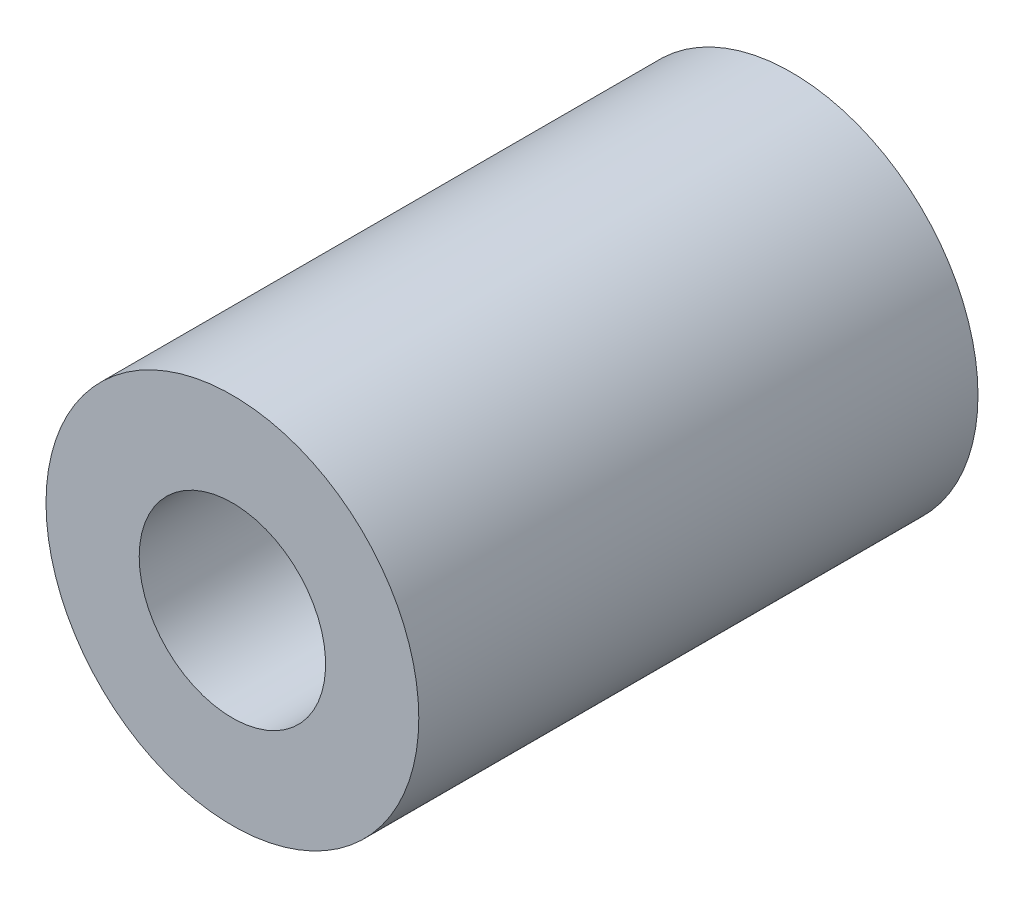
ISO-10303-21;
HEADER;
FILE_DESCRIPTION(('STEP AP214'),'2;1');
FILE_NAME('part.step','',(''),(''),'','','');
FILE_SCHEMA(('AUTOMOTIVE_DESIGN { 1 0 10303 214 1 1 1 1 }'));
ENDSEC;
DATA;
#1=APPLICATION_CONTEXT('core data for automotive mechanical design processes');
#2=APPLICATION_PROTOCOL_DEFINITION('international standard','automotive_design',2000,#1);
#3=PRODUCT_CONTEXT('',#1,'mechanical');
#4=PRODUCT('Part','Part','',(#3));
#5=PRODUCT_RELATED_PRODUCT_CATEGORY('part','',(#4));
#6=PRODUCT_DEFINITION_FORMATION('','',#4);
#7=PRODUCT_DEFINITION_CONTEXT('part definition',#1,'design');
#8=PRODUCT_DEFINITION('design','',#6,#7);
#9=PRODUCT_DEFINITION_SHAPE('','',#8);
#10=(LENGTH_UNIT() NAMED_UNIT(*) SI_UNIT(.MILLI.,.METRE.));
#11=(NAMED_UNIT(*) PLANE_ANGLE_UNIT() SI_UNIT($,.RADIAN.));
#12=(NAMED_UNIT(*) SI_UNIT($,.STERADIAN.) SOLID_ANGLE_UNIT());
#13=UNCERTAINTY_MEASURE_WITH_UNIT(LENGTH_MEASURE(1.E-05),#10,'distance_accuracy_value','');
#14=(GEOMETRIC_REPRESENTATION_CONTEXT(3) GLOBAL_UNCERTAINTY_ASSIGNED_CONTEXT((#13)) GLOBAL_UNIT_ASSIGNED_CONTEXT((#10,
#11,#12)) REPRESENTATION_CONTEXT('',''));
#15=CARTESIAN_POINT('',(0.,0.,0.));
#16=DIRECTION('',(0.,0.,1.));
#17=DIRECTION('',(1.,0.,0.));
#18=AXIS2_PLACEMENT_3D('',#15,#16,#17);
#19=CARTESIAN_POINT('',(0.,0.,9.525));
#20=DIRECTION('',(0.,0.,1.));
#21=DIRECTION('',(1.,0.,0.));
#22=AXIS2_PLACEMENT_3D('',#19,#20,#21);
#23=PLANE('',#22);
#24=CARTESIAN_POINT('',(0.,0.,9.525));
#25=DIRECTION('',(0.,0.,1.));
#26=DIRECTION('',(1.,0.,0.));
#27=AXIS2_PLACEMENT_3D('',#24,#25,#26);
#28=CIRCLE('',#27,6.35);
#29=CARTESIAN_POINT('',(-6.35,0.,9.525));
#30=VERTEX_POINT('',#29);
#31=EDGE_CURVE('E10',#30,#30,#28,.T.);
#32=ORIENTED_EDGE('',*,*,#31,.T.);
#33=EDGE_LOOP('',(#32));
#34=FACE_BOUND('',#33,.T.);
#35=CARTESIAN_POINT('',(0.,0.,9.525));
#36=DIRECTION('',(0.,0.,1.));
#37=DIRECTION('',(1.,0.,0.));
#38=AXIS2_PLACEMENT_3D('',#35,#36,#37);
#39=CIRCLE('',#38,3.175);
#40=CARTESIAN_POINT('',(-3.175,0.,9.525));
#41=VERTEX_POINT('',#40);
#42=EDGE_CURVE('E42',#41,#41,#39,.T.);
#43=ORIENTED_EDGE('',*,*,#42,.F.);
#44=EDGE_LOOP('',(#43));
#45=FACE_BOUND('',#44,.T.);
#46=ADVANCED_FACE('F31',(#34,#45),#23,.T.);
#47=CARTESIAN_POINT('',(0.,0.,-9.525));
#48=DIRECTION('',(0.,0.,1.));
#49=DIRECTION('',(1.,0.,0.));
#50=AXIS2_PLACEMENT_3D('',#47,#48,#49);
#51=PLANE('',#50);
#52=CARTESIAN_POINT('',(0.,0.,-9.525));
#53=DIRECTION('',(0.,0.,1.));
#54=DIRECTION('',(1.,0.,0.));
#55=AXIS2_PLACEMENT_3D('',#52,#53,#54);
#56=CIRCLE('',#55,6.35);
#57=CARTESIAN_POINT('',(-6.35,0.,-9.525));
#58=VERTEX_POINT('',#57);
#59=EDGE_CURVE('E35',#58,#58,#56,.T.);
#60=ORIENTED_EDGE('',*,*,#59,.F.);
#61=EDGE_LOOP('',(#60));
#62=FACE_BOUND('',#61,.T.);
#63=CARTESIAN_POINT('',(0.,0.,-9.525));
#64=DIRECTION('',(0.,0.,1.));
#65=DIRECTION('',(1.,0.,0.));
#66=AXIS2_PLACEMENT_3D('',#63,#64,#65);
#67=CIRCLE('',#66,3.175);
#68=CARTESIAN_POINT('',(-3.175,0.,-9.525));
#69=VERTEX_POINT('',#68);
#70=EDGE_CURVE('E44',#69,#69,#67,.T.);
#71=ORIENTED_EDGE('',*,*,#70,.T.);
#72=EDGE_LOOP('',(#71));
#73=FACE_BOUND('',#72,.T.);
#74=ADVANCED_FACE('F54',(#62,#73),#51,.F.);
#75=CARTESIAN_POINT('',(0.,0.,9.525));
#76=DIRECTION('',(0.,0.,-1.));
#77=DIRECTION('',(-1.,0.,0.));
#78=AXIS2_PLACEMENT_3D('',#75,#76,#77);
#79=CYLINDRICAL_SURFACE('',#78,6.35);
#80=CARTESIAN_POINT('',(-6.35,0.,9.525));
#81=CARTESIAN_POINT('',(-6.35,0.,9.3265625));
#82=CARTESIAN_POINT('',(-6.35,0.,9.128125));
#83=CARTESIAN_POINT('',(-6.35,0.,8.73125));
#84=CARTESIAN_POINT('',(-6.35,0.,8.5328125));
#85=CARTESIAN_POINT('',(-6.35,0.,8.1359375));
#86=CARTESIAN_POINT('',(-6.35,0.,7.9375));
#87=CARTESIAN_POINT('',(-6.35,0.,7.540625));
#88=CARTESIAN_POINT('',(-6.35,0.,7.3421875));
#89=CARTESIAN_POINT('',(-6.35,0.,6.9453125));
#90=CARTESIAN_POINT('',(-6.35,0.,6.746875));
#91=CARTESIAN_POINT('',(-6.35,0.,6.35));
#92=CARTESIAN_POINT('',(-6.35,0.,6.1515625));
#93=CARTESIAN_POINT('',(-6.35,0.,5.7546875));
#94=CARTESIAN_POINT('',(-6.35,0.,5.55625));
#95=CARTESIAN_POINT('',(-6.35,0.,5.159375));
#96=CARTESIAN_POINT('',(-6.35,0.,4.9609375));
#97=CARTESIAN_POINT('',(-6.35,0.,4.5640625));
#98=CARTESIAN_POINT('',(-6.35,0.,4.365625));
#99=CARTESIAN_POINT('',(-6.35,0.,3.96875));
#100=CARTESIAN_POINT('',(-6.35,0.,3.7703125));
#101=CARTESIAN_POINT('',(-6.35,0.,3.3734375));
#102=CARTESIAN_POINT('',(-6.35,0.,3.175));
#103=CARTESIAN_POINT('',(-6.35,0.,2.778125));
#104=CARTESIAN_POINT('',(-6.35,0.,2.5796875));
#105=CARTESIAN_POINT('',(-6.35,0.,2.1828125));
#106=CARTESIAN_POINT('',(-6.35,0.,1.984375));
#107=CARTESIAN_POINT('',(-6.35,0.,1.5875));
#108=CARTESIAN_POINT('',(-6.35,0.,1.3890625));
#109=CARTESIAN_POINT('',(-6.35,0.,0.992187500000001));
#110=CARTESIAN_POINT('',(-6.35,0.,0.793750000000001));
#111=CARTESIAN_POINT('',(-6.35,0.,0.396875));
#112=CARTESIAN_POINT('',(-6.35,0.,0.1984375));
#113=CARTESIAN_POINT('',(-6.35,0.,-0.1984375));
#114=CARTESIAN_POINT('',(-6.35,0.,-0.396875));
#115=CARTESIAN_POINT('',(-6.35,0.,-0.793750000000001));
#116=CARTESIAN_POINT('',(-6.35,0.,-0.992187500000001));
#117=CARTESIAN_POINT('',(-6.35,0.,-1.3890625));
#118=CARTESIAN_POINT('',(-6.35,0.,-1.5875));
#119=CARTESIAN_POINT('',(-6.35,0.,-1.984375));
#120=CARTESIAN_POINT('',(-6.35,0.,-2.1828125));
#121=CARTESIAN_POINT('',(-6.35,0.,-2.5796875));
#122=CARTESIAN_POINT('',(-6.35,0.,-2.778125));
#123=CARTESIAN_POINT('',(-6.35,0.,-3.175));
#124=CARTESIAN_POINT('',(-6.35,0.,-3.3734375));
#125=CARTESIAN_POINT('',(-6.35,0.,-3.7703125));
#126=CARTESIAN_POINT('',(-6.35,0.,-3.96875));
#127=CARTESIAN_POINT('',(-6.35,0.,-4.365625));
#128=CARTESIAN_POINT('',(-6.35,0.,-4.5640625));
#129=CARTESIAN_POINT('',(-6.35,0.,-4.9609375));
#130=CARTESIAN_POINT('',(-6.35,0.,-5.159375));
#131=CARTESIAN_POINT('',(-6.35,0.,-5.55625));
#132=CARTESIAN_POINT('',(-6.35,0.,-5.7546875));
#133=CARTESIAN_POINT('',(-6.35,0.,-6.1515625));
#134=CARTESIAN_POINT('',(-6.35,0.,-6.35));
#135=CARTESIAN_POINT('',(-6.35,0.,-6.746875));
#136=CARTESIAN_POINT('',(-6.35,0.,-6.9453125));
#137=CARTESIAN_POINT('',(-6.35,0.,-7.3421875));
#138=CARTESIAN_POINT('',(-6.35,0.,-7.540625));
#139=CARTESIAN_POINT('',(-6.35,0.,-7.9375));
#140=CARTESIAN_POINT('',(-6.35,0.,-8.1359375));
#141=CARTESIAN_POINT('',(-6.35,0.,-8.5328125));
#142=CARTESIAN_POINT('',(-6.35,0.,-8.73125));
#143=CARTESIAN_POINT('',(-6.35,0.,-9.128125));
#144=CARTESIAN_POINT('',(-6.35,0.,-9.3265625));
#145=CARTESIAN_POINT('',(-6.35,0.,-9.525));
#146=B_SPLINE_CURVE_WITH_KNOTS('',3,(#80,#81,#82,#83,#84,#85,#86,#87,#88,#89,#90,#91,#92,#93,
#94,#95,#96,#97,#98,#99,#100,#101,#102,#103,#104,#105,#106,#107,#108,#109,#110,#111,#112,#113,
#114,#115,#116,#117,#118,#119,#120,#121,#122,#123,#124,#125,#126,#127,#128,#129,#130,#131,#132,
#133,#134,#135,#136,#137,#138,#139,#140,#141,#142,#143,#144,#145),.UNSPECIFIED.,.F.,.F.,(4,2,2,
2,2,2,2,2,2,2,2,2,2,2,2,2,2,2,2,2,2,2,2,2,2,2,2,2,2,2,2,2,4),(0.,0.5953125,1.190625,1.7859375,
2.38125,2.9765625,3.571875,4.1671875,4.7625,5.3578125,5.953125,6.5484375,7.14375,7.7390625,
8.334375,8.9296875,9.525,10.1203125,10.715625,11.3109375,11.90625,12.5015625,13.096875,
13.6921875,14.2875,14.8828125,15.478125,16.0734375,16.66875,17.2640625,17.859375,18.4546875,
19.05),.UNSPECIFIED.);
#147=EDGE_CURVE('BSEAM33',#30,#58,#146,.T.);
#148=ORIENTED_EDGE('',*,*,#31,.F.);
#149=ORIENTED_EDGE('',*,*,#59,.T.);
#150=ORIENTED_EDGE('',*,*,#147,.T.);
#151=ORIENTED_EDGE('',*,*,#147,.F.);
#152=EDGE_LOOP('',(#148,#150,#149,#151));
#153=FACE_BOUND('',#152,.T.);
#154=ADVANCED_FACE('F33',(#153),#79,.T.);
#155=CARTESIAN_POINT('',(0.,0.,9.525));
#156=DIRECTION('',(0.,0.,-1.));
#157=DIRECTION('',(-1.,0.,0.));
#158=AXIS2_PLACEMENT_3D('',#155,#156,#157);
#159=CYLINDRICAL_SURFACE('',#158,3.175);
#160=CARTESIAN_POINT('',(-3.175,0.,9.525));
#161=CARTESIAN_POINT('',(-3.175,0.,9.3265625));
#162=CARTESIAN_POINT('',(-3.175,0.,9.128125));
#163=CARTESIAN_POINT('',(-3.175,0.,8.73125));
#164=CARTESIAN_POINT('',(-3.175,0.,8.5328125));
#165=CARTESIAN_POINT('',(-3.175,0.,8.1359375));
#166=CARTESIAN_POINT('',(-3.175,0.,7.9375));
#167=CARTESIAN_POINT('',(-3.175,0.,7.540625));
#168=CARTESIAN_POINT('',(-3.175,0.,7.3421875));
#169=CARTESIAN_POINT('',(-3.175,0.,6.9453125));
#170=CARTESIAN_POINT('',(-3.175,0.,6.746875));
#171=CARTESIAN_POINT('',(-3.175,0.,6.35));
#172=CARTESIAN_POINT('',(-3.175,0.,6.1515625));
#173=CARTESIAN_POINT('',(-3.175,0.,5.7546875));
#174=CARTESIAN_POINT('',(-3.175,0.,5.55625));
#175=CARTESIAN_POINT('',(-3.175,0.,5.159375));
#176=CARTESIAN_POINT('',(-3.175,0.,4.9609375));
#177=CARTESIAN_POINT('',(-3.175,0.,4.5640625));
#178=CARTESIAN_POINT('',(-3.175,0.,4.365625));
#179=CARTESIAN_POINT('',(-3.175,0.,3.96875));
#180=CARTESIAN_POINT('',(-3.175,0.,3.7703125));
#181=CARTESIAN_POINT('',(-3.175,0.,3.3734375));
#182=CARTESIAN_POINT('',(-3.175,0.,3.175));
#183=CARTESIAN_POINT('',(-3.175,0.,2.778125));
#184=CARTESIAN_POINT('',(-3.175,0.,2.5796875));
#185=CARTESIAN_POINT('',(-3.175,0.,2.1828125));
#186=CARTESIAN_POINT('',(-3.175,0.,1.984375));
#187=CARTESIAN_POINT('',(-3.175,0.,1.5875));
#188=CARTESIAN_POINT('',(-3.175,0.,1.3890625));
#189=CARTESIAN_POINT('',(-3.175,0.,0.992187499999999));
#190=CARTESIAN_POINT('',(-3.175,0.,0.793749999999999));
#191=CARTESIAN_POINT('',(-3.175,0.,0.396874999999998));
#192=CARTESIAN_POINT('',(-3.175,0.,0.198437499999998));
#193=CARTESIAN_POINT('',(-3.175,0.,-0.198437500000002));
#194=CARTESIAN_POINT('',(-3.175,0.,-0.396875000000002));
#195=CARTESIAN_POINT('',(-3.175,0.,-0.793750000000002));
#196=CARTESIAN_POINT('',(-3.175,0.,-0.992187500000002));
#197=CARTESIAN_POINT('',(-3.175,0.,-1.3890625));
#198=CARTESIAN_POINT('',(-3.175,0.,-1.5875));
#199=CARTESIAN_POINT('',(-3.175,0.,-1.984375));
#200=CARTESIAN_POINT('',(-3.175,0.,-2.1828125));
#201=CARTESIAN_POINT('',(-3.175,0.,-2.5796875));
#202=CARTESIAN_POINT('',(-3.175,0.,-2.778125));
#203=CARTESIAN_POINT('',(-3.175,0.,-3.175));
#204=CARTESIAN_POINT('',(-3.175,0.,-3.3734375));
#205=CARTESIAN_POINT('',(-3.175,0.,-3.7703125));
#206=CARTESIAN_POINT('',(-3.175,0.,-3.96875));
#207=CARTESIAN_POINT('',(-3.175,0.,-4.365625));
#208=CARTESIAN_POINT('',(-3.175,0.,-4.5640625));
#209=CARTESIAN_POINT('',(-3.175,0.,-4.9609375));
#210=CARTESIAN_POINT('',(-3.175,0.,-5.159375));
#211=CARTESIAN_POINT('',(-3.175,0.,-5.55625));
#212=CARTESIAN_POINT('',(-3.175,0.,-5.7546875));
#213=CARTESIAN_POINT('',(-3.175,0.,-6.1515625));
#214=CARTESIAN_POINT('',(-3.175,0.,-6.35));
#215=CARTESIAN_POINT('',(-3.175,0.,-6.746875));
#216=CARTESIAN_POINT('',(-3.175,0.,-6.9453125));
#217=CARTESIAN_POINT('',(-3.175,0.,-7.3421875));
#218=CARTESIAN_POINT('',(-3.175,0.,-7.540625));
#219=CARTESIAN_POINT('',(-3.175,0.,-7.9375));
#220=CARTESIAN_POINT('',(-3.175,0.,-8.1359375));
#221=CARTESIAN_POINT('',(-3.175,0.,-8.5328125));
#222=CARTESIAN_POINT('',(-3.175,0.,-8.73125));
#223=CARTESIAN_POINT('',(-3.175,0.,-9.128125));
#224=CARTESIAN_POINT('',(-3.175,0.,-9.3265625));
#225=CARTESIAN_POINT('',(-3.175,0.,-9.525));
#226=B_SPLINE_CURVE_WITH_KNOTS('',3,(#160,#161,#162,#163,#164,#165,#166,#167,#168,#169,#170,
#171,#172,#173,#174,#175,#176,#177,#178,#179,#180,#181,#182,#183,#184,#185,#186,#187,#188,#189,
#190,#191,#192,#193,#194,#195,#196,#197,#198,#199,#200,#201,#202,#203,#204,#205,#206,#207,#208,
#209,#210,#211,#212,#213,#214,#215,#216,#217,#218,#219,#220,#221,#222,#223,#224,#225),
.UNSPECIFIED.,.F.,.F.,(4,2,2,2,2,2,2,2,2,2,2,2,2,2,2,2,2,2,2,2,2,2,2,2,2,2,2,2,2,2,2,2,4),(0.,
0.595312499999999,1.190625,1.7859375,2.38125,2.9765625,3.571875,4.1671875,4.7625,5.3578125,
5.953125,6.5484375,7.14375,7.7390625,8.334375,8.9296875,9.525,10.1203125,10.715625,11.3109375,
11.90625,12.5015625,13.096875,13.6921875,14.2875,14.8828125,15.478125,16.0734375,16.66875,
17.2640625,17.859375,18.4546875,19.05),.UNSPECIFIED.);
#227=EDGE_CURVE('BSEAM50',#41,#69,#226,.T.);
#228=ORIENTED_EDGE('',*,*,#42,.T.);
#229=ORIENTED_EDGE('',*,*,#70,.F.);
#230=ORIENTED_EDGE('',*,*,#227,.T.);
#231=ORIENTED_EDGE('',*,*,#227,.F.);
#232=EDGE_LOOP('',(#228,#230,#229,#231));
#233=FACE_BOUND('',#232,.T.);
#234=ADVANCED_FACE('F50',(#233),#159,.F.);
#235=CLOSED_SHELL('',(#46,#74,#154,#234));
#236=MANIFOLD_SOLID_BREP('B2',#235);
#237=ADVANCED_BREP_SHAPE_REPRESENTATION('',(#18,#236),#14);
#238=SHAPE_DEFINITION_REPRESENTATION(#9,#237);
ENDSEC;
END-ISO-10303-21;
